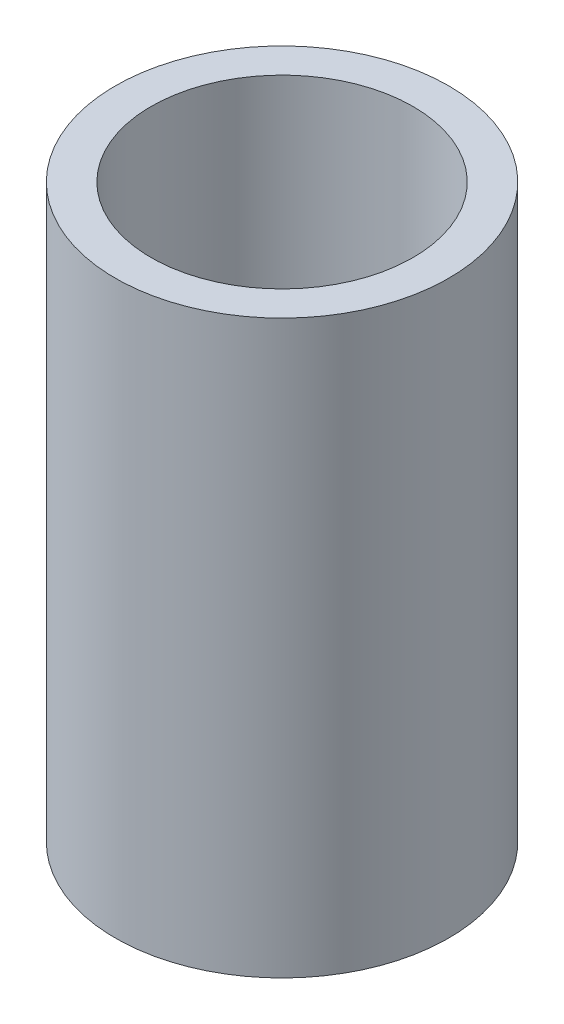
ISO-10303-21;
HEADER;
FILE_DESCRIPTION(('STEP AP214'),'2;1');
FILE_NAME('part.step','',(''),(''),'','','');
FILE_SCHEMA(('AUTOMOTIVE_DESIGN { 1 0 10303 214 1 1 1 1 }'));
ENDSEC;
DATA;
#1=APPLICATION_CONTEXT('core data for automotive mechanical design processes');
#2=APPLICATION_PROTOCOL_DEFINITION('international standard','automotive_design',2000,#1);
#3=PRODUCT_CONTEXT('',#1,'mechanical');
#4=PRODUCT('Part','Part','',(#3));
#5=PRODUCT_RELATED_PRODUCT_CATEGORY('part','',(#4));
#6=PRODUCT_DEFINITION_FORMATION('','',#4);
#7=PRODUCT_DEFINITION_CONTEXT('part definition',#1,'design');
#8=PRODUCT_DEFINITION('design','',#6,#7);
#9=PRODUCT_DEFINITION_SHAPE('','',#8);
#10=(LENGTH_UNIT() NAMED_UNIT(*) SI_UNIT(.MILLI.,.METRE.));
#11=(NAMED_UNIT(*) PLANE_ANGLE_UNIT() SI_UNIT($,.RADIAN.));
#12=(NAMED_UNIT(*) SI_UNIT($,.STERADIAN.) SOLID_ANGLE_UNIT());
#13=UNCERTAINTY_MEASURE_WITH_UNIT(LENGTH_MEASURE(1.E-05),#10,'distance_accuracy_value','');
#14=(GEOMETRIC_REPRESENTATION_CONTEXT(3) GLOBAL_UNCERTAINTY_ASSIGNED_CONTEXT((#13)) GLOBAL_UNIT_ASSIGNED_CONTEXT((#10,
#11,#12)) REPRESENTATION_CONTEXT('',''));
#15=CARTESIAN_POINT('',(0.,0.,0.));
#16=DIRECTION('',(0.,0.,1.));
#17=DIRECTION('',(1.,0.,0.));
#18=AXIS2_PLACEMENT_3D('',#15,#16,#17);
#19=CARTESIAN_POINT('',(0.,152.4,0.));
#20=DIRECTION('',(0.,1.,0.));
#21=DIRECTION('',(0.,0.,1.));
#22=AXIS2_PLACEMENT_3D('',#19,#20,#21);
#23=PLANE('',#22);
#24=CARTESIAN_POINT('',(0.,152.4,0.));
#25=DIRECTION('',(0.,1.,0.));
#26=DIRECTION('',(0.,0.,1.));
#27=AXIS2_PLACEMENT_3D('',#24,#25,#26);
#28=CIRCLE('',#27,44.45);
#29=CARTESIAN_POINT('',(0.,152.4,-44.45));
#30=VERTEX_POINT('',#29);
#31=EDGE_CURVE('E10',#30,#30,#28,.T.);
#32=ORIENTED_EDGE('',*,*,#31,.T.);
#33=EDGE_LOOP('',(#32));
#34=FACE_BOUND('',#33,.T.);
#35=CARTESIAN_POINT('',(0.,152.4,0.));
#36=DIRECTION('',(0.,1.,0.));
#37=DIRECTION('',(0.,0.,1.));
#38=AXIS2_PLACEMENT_3D('',#35,#36,#37);
#39=CIRCLE('',#38,34.925);
#40=CARTESIAN_POINT('',(0.,152.4,-34.925));
#41=VERTEX_POINT('',#40);
#42=EDGE_CURVE('E48',#41,#41,#39,.T.);
#43=ORIENTED_EDGE('',*,*,#42,.F.);
#44=EDGE_LOOP('',(#43));
#45=FACE_BOUND('',#44,.T.);
#46=ADVANCED_FACE('F37',(#34,#45),#23,.T.);
#47=CARTESIAN_POINT('',(0.,0.,0.));
#48=DIRECTION('',(0.,1.,0.));
#49=DIRECTION('',(0.,0.,1.));
#50=AXIS2_PLACEMENT_3D('',#47,#48,#49);
#51=PLANE('',#50);
#52=CARTESIAN_POINT('',(0.,0.,0.));
#53=DIRECTION('',(0.,1.,0.));
#54=DIRECTION('',(0.,0.,1.));
#55=AXIS2_PLACEMENT_3D('',#52,#53,#54);
#56=CIRCLE('',#55,44.45);
#57=CARTESIAN_POINT('',(0.,0.,-44.45));
#58=VERTEX_POINT('',#57);
#59=EDGE_CURVE('E41',#58,#58,#56,.T.);
#60=ORIENTED_EDGE('',*,*,#59,.F.);
#61=EDGE_LOOP('',(#60));
#62=FACE_BOUND('',#61,.T.);
#63=CARTESIAN_POINT('',(0.,0.,0.));
#64=DIRECTION('',(0.,1.,0.));
#65=DIRECTION('',(0.,0.,1.));
#66=AXIS2_PLACEMENT_3D('',#63,#64,#65);
#67=CIRCLE('',#66,34.925);
#68=CARTESIAN_POINT('',(0.,0.,-34.925));
#69=VERTEX_POINT('',#68);
#70=EDGE_CURVE('E50',#69,#69,#67,.T.);
#71=ORIENTED_EDGE('',*,*,#70,.T.);
#72=EDGE_LOOP('',(#71));
#73=FACE_BOUND('',#72,.T.);
#74=ADVANCED_FACE('F60',(#62,#73),#51,.F.);
#75=CARTESIAN_POINT('',(0.,152.4,0.));
#76=DIRECTION('',(0.,-1.,0.));
#77=DIRECTION('',(0.,0.,-1.));
#78=AXIS2_PLACEMENT_3D('',#75,#76,#77);
#79=CYLINDRICAL_SURFACE('',#78,44.45);
#80=CARTESIAN_POINT('',(0.,152.4,-44.45));
#81=CARTESIAN_POINT('',(0.,150.8125,-44.45));
#82=CARTESIAN_POINT('',(0.,149.225,-44.45));
#83=CARTESIAN_POINT('',(0.,146.05,-44.45));
#84=CARTESIAN_POINT('',(0.,144.4625,-44.45));
#85=CARTESIAN_POINT('',(0.,141.2875,-44.45));
#86=CARTESIAN_POINT('',(0.,139.7,-44.45));
#87=CARTESIAN_POINT('',(0.,136.525,-44.45));
#88=CARTESIAN_POINT('',(0.,134.9375,-44.45));
#89=CARTESIAN_POINT('',(0.,131.7625,-44.45));
#90=CARTESIAN_POINT('',(0.,130.175,-44.45));
#91=CARTESIAN_POINT('',(0.,127.,-44.45));
#92=CARTESIAN_POINT('',(0.,125.4125,-44.45));
#93=CARTESIAN_POINT('',(0.,122.2375,-44.45));
#94=CARTESIAN_POINT('',(0.,120.65,-44.45));
#95=CARTESIAN_POINT('',(0.,117.475,-44.45));
#96=CARTESIAN_POINT('',(0.,115.8875,-44.45));
#97=CARTESIAN_POINT('',(0.,112.7125,-44.45));
#98=CARTESIAN_POINT('',(0.,111.125,-44.45));
#99=CARTESIAN_POINT('',(0.,107.95,-44.45));
#100=CARTESIAN_POINT('',(0.,106.3625,-44.45));
#101=CARTESIAN_POINT('',(0.,103.1875,-44.45));
#102=CARTESIAN_POINT('',(0.,101.6,-44.45));
#103=CARTESIAN_POINT('',(0.,98.425,-44.45));
#104=CARTESIAN_POINT('',(0.,96.8375,-44.45));
#105=CARTESIAN_POINT('',(0.,93.6625,-44.45));
#106=CARTESIAN_POINT('',(0.,92.075,-44.45));
#107=CARTESIAN_POINT('',(0.,88.9,-44.45));
#108=CARTESIAN_POINT('',(0.,87.3125,-44.45));
#109=CARTESIAN_POINT('',(0.,84.1375,-44.45));
#110=CARTESIAN_POINT('',(0.,82.55,-44.45));
#111=CARTESIAN_POINT('',(0.,79.375,-44.45));
#112=CARTESIAN_POINT('',(0.,77.7875,-44.45));
#113=CARTESIAN_POINT('',(0.,74.6125,-44.45));
#114=CARTESIAN_POINT('',(0.,73.025,-44.45));
#115=CARTESIAN_POINT('',(0.,69.85,-44.45));
#116=CARTESIAN_POINT('',(0.,68.2625,-44.45));
#117=CARTESIAN_POINT('',(0.,65.0875,-44.45));
#118=CARTESIAN_POINT('',(0.,63.5,-44.45));
#119=CARTESIAN_POINT('',(0.,60.325,-44.45));
#120=CARTESIAN_POINT('',(0.,58.7375,-44.45));
#121=CARTESIAN_POINT('',(0.,55.5625,-44.45));
#122=CARTESIAN_POINT('',(0.,53.975,-44.45));
#123=CARTESIAN_POINT('',(0.,50.8,-44.45));
#124=CARTESIAN_POINT('',(0.,49.2125,-44.45));
#125=CARTESIAN_POINT('',(0.,46.0375,-44.45));
#126=CARTESIAN_POINT('',(0.,44.45,-44.45));
#127=CARTESIAN_POINT('',(0.,41.275,-44.45));
#128=CARTESIAN_POINT('',(0.,39.6875,-44.45));
#129=CARTESIAN_POINT('',(0.,36.5125,-44.45));
#130=CARTESIAN_POINT('',(0.,34.925,-44.45));
#131=CARTESIAN_POINT('',(0.,31.75,-44.45));
#132=CARTESIAN_POINT('',(0.,30.1625,-44.45));
#133=CARTESIAN_POINT('',(0.,26.9875,-44.45));
#134=CARTESIAN_POINT('',(0.,25.4,-44.45));
#135=CARTESIAN_POINT('',(0.,22.225,-44.45));
#136=CARTESIAN_POINT('',(0.,20.6375,-44.45));
#137=CARTESIAN_POINT('',(0.,17.4625,-44.45));
#138=CARTESIAN_POINT('',(0.,15.875,-44.45));
#139=CARTESIAN_POINT('',(0.,12.7,-44.45));
#140=CARTESIAN_POINT('',(0.,11.1125,-44.45));
#141=CARTESIAN_POINT('',(0.,7.93750000000001,-44.45));
#142=CARTESIAN_POINT('',(0.,6.35,-44.45));
#143=CARTESIAN_POINT('',(0.,3.175,-44.45));
#144=CARTESIAN_POINT('',(0.,1.5875,-44.45));
#145=CARTESIAN_POINT('',(0.,0.,-44.45));
#146=B_SPLINE_CURVE_WITH_KNOTS('',3,(#80,#81,#82,#83,#84,#85,#86,#87,#88,#89,#90,#91,#92,#93,
#94,#95,#96,#97,#98,#99,#100,#101,#102,#103,#104,#105,#106,#107,#108,#109,#110,#111,#112,#113,
#114,#115,#116,#117,#118,#119,#120,#121,#122,#123,#124,#125,#126,#127,#128,#129,#130,#131,#132,
#133,#134,#135,#136,#137,#138,#139,#140,#141,#142,#143,#144,#145),.UNSPECIFIED.,.F.,.F.,(4,2,2,
2,2,2,2,2,2,2,2,2,2,2,2,2,2,2,2,2,2,2,2,2,2,2,2,2,2,2,2,2,4),(0.,4.76249999999998,
9.52499999999998,14.2875,19.05,23.8125,28.575,33.3375,38.1,42.8625,47.625,52.3875,57.15,61.9125,
66.675,71.4375,76.2,80.9625,85.725,90.4875,95.25,100.0125,104.775,109.5375,114.3,119.0625,
123.825,128.5875,133.35,138.1125,142.875,147.6375,152.4),.UNSPECIFIED.);
#147=EDGE_CURVE('BSEAM39',#30,#58,#146,.T.);
#148=ORIENTED_EDGE('',*,*,#31,.F.);
#149=ORIENTED_EDGE('',*,*,#59,.T.);
#150=ORIENTED_EDGE('',*,*,#147,.T.);
#151=ORIENTED_EDGE('',*,*,#147,.F.);
#152=EDGE_LOOP('',(#148,#150,#149,#151));
#153=FACE_BOUND('',#152,.T.);
#154=ADVANCED_FACE('F39',(#153),#79,.T.);
#155=CARTESIAN_POINT('',(0.,152.4,0.));
#156=DIRECTION('',(0.,-1.,0.));
#157=DIRECTION('',(0.,0.,-1.));
#158=AXIS2_PLACEMENT_3D('',#155,#156,#157);
#159=CYLINDRICAL_SURFACE('',#158,34.925);
#160=CARTESIAN_POINT('',(0.,152.4,-34.925));
#161=CARTESIAN_POINT('',(0.,150.8125,-34.925));
#162=CARTESIAN_POINT('',(0.,149.225,-34.925));
#163=CARTESIAN_POINT('',(0.,146.05,-34.925));
#164=CARTESIAN_POINT('',(0.,144.4625,-34.925));
#165=CARTESIAN_POINT('',(0.,141.2875,-34.925));
#166=CARTESIAN_POINT('',(0.,139.7,-34.925));
#167=CARTESIAN_POINT('',(0.,136.525,-34.925));
#168=CARTESIAN_POINT('',(0.,134.9375,-34.925));
#169=CARTESIAN_POINT('',(0.,131.7625,-34.925));
#170=CARTESIAN_POINT('',(0.,130.175,-34.925));
#171=CARTESIAN_POINT('',(0.,127.,-34.925));
#172=CARTESIAN_POINT('',(0.,125.4125,-34.925));
#173=CARTESIAN_POINT('',(0.,122.2375,-34.925));
#174=CARTESIAN_POINT('',(0.,120.65,-34.925));
#175=CARTESIAN_POINT('',(0.,117.475,-34.925));
#176=CARTESIAN_POINT('',(0.,115.8875,-34.925));
#177=CARTESIAN_POINT('',(0.,112.7125,-34.925));
#178=CARTESIAN_POINT('',(0.,111.125,-34.925));
#179=CARTESIAN_POINT('',(0.,107.95,-34.925));
#180=CARTESIAN_POINT('',(0.,106.3625,-34.925));
#181=CARTESIAN_POINT('',(0.,103.1875,-34.925));
#182=CARTESIAN_POINT('',(0.,101.6,-34.925));
#183=CARTESIAN_POINT('',(0.,98.425,-34.925));
#184=CARTESIAN_POINT('',(0.,96.8375,-34.925));
#185=CARTESIAN_POINT('',(0.,93.6625,-34.925));
#186=CARTESIAN_POINT('',(0.,92.075,-34.925));
#187=CARTESIAN_POINT('',(0.,88.9,-34.925));
#188=CARTESIAN_POINT('',(0.,87.3125,-34.925));
#189=CARTESIAN_POINT('',(0.,84.1375,-34.925));
#190=CARTESIAN_POINT('',(0.,82.55,-34.925));
#191=CARTESIAN_POINT('',(0.,79.375,-34.925));
#192=CARTESIAN_POINT('',(0.,77.7875,-34.925));
#193=CARTESIAN_POINT('',(0.,74.6125,-34.925));
#194=CARTESIAN_POINT('',(0.,73.025,-34.925));
#195=CARTESIAN_POINT('',(0.,69.85,-34.925));
#196=CARTESIAN_POINT('',(0.,68.2625,-34.925));
#197=CARTESIAN_POINT('',(0.,65.0875,-34.925));
#198=CARTESIAN_POINT('',(0.,63.5,-34.925));
#199=CARTESIAN_POINT('',(0.,60.325,-34.925));
#200=CARTESIAN_POINT('',(0.,58.7375,-34.925));
#201=CARTESIAN_POINT('',(0.,55.5625,-34.925));
#202=CARTESIAN_POINT('',(0.,53.975,-34.925));
#203=CARTESIAN_POINT('',(0.,50.8,-34.925));
#204=CARTESIAN_POINT('',(0.,49.2125,-34.925));
#205=CARTESIAN_POINT('',(0.,46.0375,-34.925));
#206=CARTESIAN_POINT('',(0.,44.45,-34.925));
#207=CARTESIAN_POINT('',(0.,41.275,-34.925));
#208=CARTESIAN_POINT('',(0.,39.6875,-34.925));
#209=CARTESIAN_POINT('',(0.,36.5125,-34.925));
#210=CARTESIAN_POINT('',(0.,34.925,-34.925));
#211=CARTESIAN_POINT('',(0.,31.75,-34.925));
#212=CARTESIAN_POINT('',(0.,30.1625,-34.925));
#213=CARTESIAN_POINT('',(0.,26.9875,-34.925));
#214=CARTESIAN_POINT('',(0.,25.4,-34.925));
#215=CARTESIAN_POINT('',(0.,22.225,-34.925));
#216=CARTESIAN_POINT('',(0.,20.6375,-34.925));
#217=CARTESIAN_POINT('',(0.,17.4625,-34.925));
#218=CARTESIAN_POINT('',(0.,15.875,-34.925));
#219=CARTESIAN_POINT('',(0.,12.7,-34.925));
#220=CARTESIAN_POINT('',(0.,11.1125,-34.925));
#221=CARTESIAN_POINT('',(0.,7.93750000000001,-34.925));
#222=CARTESIAN_POINT('',(0.,6.35,-34.925));
#223=CARTESIAN_POINT('',(0.,3.175,-34.925));
#224=CARTESIAN_POINT('',(0.,1.5875,-34.925));
#225=CARTESIAN_POINT('',(0.,0.,-34.925));
#226=B_SPLINE_CURVE_WITH_KNOTS('',3,(#160,#161,#162,#163,#164,#165,#166,#167,#168,#169,#170,
#171,#172,#173,#174,#175,#176,#177,#178,#179,#180,#181,#182,#183,#184,#185,#186,#187,#188,#189,
#190,#191,#192,#193,#194,#195,#196,#197,#198,#199,#200,#201,#202,#203,#204,#205,#206,#207,#208,
#209,#210,#211,#212,#213,#214,#215,#216,#217,#218,#219,#220,#221,#222,#223,#224,#225),
.UNSPECIFIED.,.F.,.F.,(4,2,2,2,2,2,2,2,2,2,2,2,2,2,2,2,2,2,2,2,2,2,2,2,2,2,2,2,2,2,2,2,4),(0.,
4.76249999999998,9.52499999999998,14.2875,19.05,23.8125,28.575,33.3375,38.1,42.8625,47.625,
52.3875,57.15,61.9125,66.675,71.4375,76.2,80.9625,85.725,90.4875,95.25,100.0125,104.775,
109.5375,114.3,119.0625,123.825,128.5875,133.35,138.1125,142.875,147.6375,152.4),.UNSPECIFIED.);
#227=EDGE_CURVE('BSEAM56',#41,#69,#226,.T.);
#228=ORIENTED_EDGE('',*,*,#42,.T.);
#229=ORIENTED_EDGE('',*,*,#70,.F.);
#230=ORIENTED_EDGE('',*,*,#227,.T.);
#231=ORIENTED_EDGE('',*,*,#227,.F.);
#232=EDGE_LOOP('',(#228,#230,#229,#231));
#233=FACE_BOUND('',#232,.T.);
#234=ADVANCED_FACE('F56',(#233),#159,.F.);
#235=CLOSED_SHELL('',(#46,#74,#154,#234));
#236=MANIFOLD_SOLID_BREP('B2',#235);
#237=ADVANCED_BREP_SHAPE_REPRESENTATION('',(#18,#236),#14);
#238=SHAPE_DEFINITION_REPRESENTATION(#9,#237);
ENDSEC;
END-ISO-10303-21;
